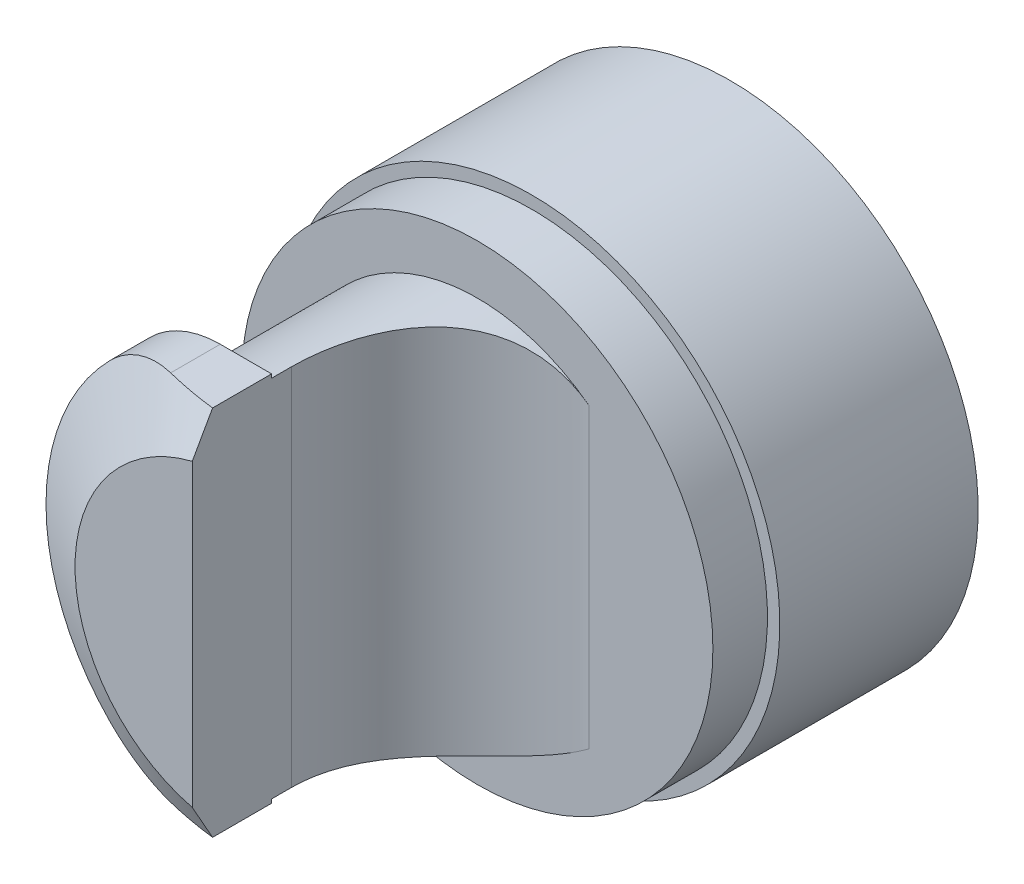
ISO-10303-21;
HEADER;
FILE_DESCRIPTION(('STEP AP214'),'2;1');
FILE_NAME('part.step','',(''),(''),'','','');
FILE_SCHEMA(('AUTOMOTIVE_DESIGN { 1 0 10303 214 1 1 1 1 }'));
ENDSEC;
DATA;
#1=APPLICATION_CONTEXT('core data for automotive mechanical design processes');
#2=APPLICATION_PROTOCOL_DEFINITION('international standard','automotive_design',2000,#1);
#3=PRODUCT_CONTEXT('',#1,'mechanical');
#4=PRODUCT('Part','Part','',(#3));
#5=PRODUCT_RELATED_PRODUCT_CATEGORY('part','',(#4));
#6=PRODUCT_DEFINITION_FORMATION('','',#4);
#7=PRODUCT_DEFINITION_CONTEXT('part definition',#1,'design');
#8=PRODUCT_DEFINITION('design','',#6,#7);
#9=PRODUCT_DEFINITION_SHAPE('','',#8);
#10=(LENGTH_UNIT() NAMED_UNIT(*) SI_UNIT(.MILLI.,.METRE.));
#11=(NAMED_UNIT(*) PLANE_ANGLE_UNIT() SI_UNIT($,.RADIAN.));
#12=(NAMED_UNIT(*) SI_UNIT($,.STERADIAN.) SOLID_ANGLE_UNIT());
#13=UNCERTAINTY_MEASURE_WITH_UNIT(LENGTH_MEASURE(1.E-05),#10,'distance_accuracy_value','');
#14=(GEOMETRIC_REPRESENTATION_CONTEXT(3) GLOBAL_UNCERTAINTY_ASSIGNED_CONTEXT((#13)) GLOBAL_UNIT_ASSIGNED_CONTEXT((#10,
#11,#12)) REPRESENTATION_CONTEXT('',''));
#15=CARTESIAN_POINT('',(0.,0.,0.));
#16=DIRECTION('',(0.,0.,1.));
#17=DIRECTION('',(1.,0.,0.));
#18=AXIS2_PLACEMENT_3D('',#15,#16,#17);
#19=CARTESIAN_POINT('',(0.,0.,3.05));
#20=DIRECTION('',(0.,0.,-1.));
#21=DIRECTION('',(-1.,0.,0.));
#22=AXIS2_PLACEMENT_3D('',#19,#20,#21);
#23=CYLINDRICAL_SURFACE('',#22,2.25);
#24=CARTESIAN_POINT('',(0.,0.,2.65));
#25=DIRECTION('',(0.,0.,1.));
#26=DIRECTION('',(1.,0.,0.));
#27=AXIS2_PLACEMENT_3D('',#24,#25,#26);
#28=CIRCLE('',#27,2.25);
#29=CARTESIAN_POINT('',(-1.60682139642214,-1.575,2.65));
#30=VERTEX_POINT('',#29);
#31=CARTESIAN_POINT('',(-1.60682139642214,1.575,2.65));
#32=VERTEX_POINT('',#31);
#33=EDGE_CURVE('E140',#30,#32,#28,.F.);
#34=ORIENTED_EDGE('',*,*,#33,.T.);
#35=DIRECTION('',(0.,0.,-1.));
#36=VECTOR('',#35,1.);
#37=CARTESIAN_POINT('',(-1.60682139642214,1.575,3.05));
#38=LINE('',#37,#36);
#39=CARTESIAN_POINT('',(-1.60682139642214,1.575,2.25));
#40=VERTEX_POINT('',#39);
#41=EDGE_CURVE('E207',#32,#40,#38,.T.);
#42=ORIENTED_EDGE('',*,*,#41,.T.);
#43=CARTESIAN_POINT('',(0.,0.,2.25));
#44=DIRECTION('',(0.,0.,1.));
#45=DIRECTION('',(1.,0.,0.));
#46=AXIS2_PLACEMENT_3D('',#43,#44,#45);
#47=CIRCLE('',#46,2.25);
#48=CARTESIAN_POINT('',(-1.60682139642214,-1.575,2.25));
#49=VERTEX_POINT('',#48);
#50=EDGE_CURVE('E247',#40,#49,#47,.T.);
#51=ORIENTED_EDGE('',*,*,#50,.T.);
#52=DIRECTION('',(0.,0.,-1.));
#53=VECTOR('',#52,1.);
#54=CARTESIAN_POINT('',(-1.60682139642214,-1.575,3.05));
#55=LINE('',#54,#53);
#56=EDGE_CURVE('E209',#49,#30,#55,.F.);
#57=ORIENTED_EDGE('',*,*,#56,.T.);
#58=EDGE_LOOP('',(#34,#42,#51,#57));
#59=FACE_BOUND('',#58,.T.);
#60=ADVANCED_FACE('F32',(#59),#23,.T.);
#61=CARTESIAN_POINT('',(0.,0.,2.25));
#62=DIRECTION('',(0.,0.,1.));
#63=DIRECTION('',(1.,0.,0.));
#64=AXIS2_PLACEMENT_3D('',#61,#62,#63);
#65=PLANE('',#64);
#66=ORIENTED_EDGE('',*,*,#50,.F.);
#67=CARTESIAN_POINT('',(-0.892678553567856,0.875,2.25));
#68=DIRECTION('',(0.,0.,1.));
#69=DIRECTION('',(1.,0.,0.));
#70=AXIS2_PLACEMENT_3D('',#67,#68,#69);
#71=CIRCLE('',#70,1.);
#72=CARTESIAN_POINT('',(-0.892678553567856,1.875,2.25));
#73=VERTEX_POINT('',#72);
#74=EDGE_CURVE('E203',#40,#73,#71,.F.);
#75=ORIENTED_EDGE('',*,*,#74,.T.);
#76=DIRECTION('',(-1.,0.,0.));
#77=VECTOR('',#76,1.);
#78=CARTESIAN_POINT('',(0.,1.875,2.25));
#79=LINE('',#78,#77);
#80=CARTESIAN_POINT('',(-0.375,1.875,2.25));
#81=VERTEX_POINT('',#80);
#82=EDGE_CURVE('E131',#81,#73,#79,.T.);
#83=ORIENTED_EDGE('',*,*,#82,.F.);
#84=DIRECTION('',(0.,-1.,0.));
#85=VECTOR('',#84,1.);
#86=CARTESIAN_POINT('',(-0.375,0.,2.25));
#87=LINE('',#86,#85);
#88=CARTESIAN_POINT('',(-0.375,1.83711730708738,2.25));
#89=VERTEX_POINT('',#88);
#90=EDGE_CURVE('E130',#81,#89,#87,.T.);
#91=ORIENTED_EDGE('',*,*,#90,.T.);
#92=CARTESIAN_POINT('',(0.,0.,2.25));
#93=DIRECTION('',(0.,0.,1.));
#94=DIRECTION('',(1.,0.,0.));
#95=AXIS2_PLACEMENT_3D('',#92,#93,#94);
#96=CIRCLE('',#95,1.875);
#97=CARTESIAN_POINT('',(-0.375,-1.83711730708738,2.25));
#98=VERTEX_POINT('',#97);
#99=EDGE_CURVE('E292',#89,#98,#96,.T.);
#100=ORIENTED_EDGE('',*,*,#99,.T.);
#101=CARTESIAN_POINT('',(-0.375,-1.875,2.25));
#102=VERTEX_POINT('',#101);
#103=EDGE_CURVE('E298',#98,#102,#87,.T.);
#104=ORIENTED_EDGE('',*,*,#103,.T.);
#105=DIRECTION('',(1.,0.,0.));
#106=VECTOR('',#105,1.);
#107=CARTESIAN_POINT('',(0.,-1.875,2.25));
#108=LINE('',#107,#106);
#109=CARTESIAN_POINT('',(-0.892678553567856,-1.875,2.25));
#110=VERTEX_POINT('',#109);
#111=EDGE_CURVE('E312',#110,#102,#108,.T.);
#112=ORIENTED_EDGE('',*,*,#111,.F.);
#113=CARTESIAN_POINT('',(-0.892678553567856,-0.875,2.25));
#114=DIRECTION('',(0.,0.,1.));
#115=DIRECTION('',(1.,0.,0.));
#116=AXIS2_PLACEMENT_3D('',#113,#114,#115);
#117=CIRCLE('',#116,1.);
#118=EDGE_CURVE('E205',#110,#49,#117,.F.);
#119=ORIENTED_EDGE('',*,*,#118,.T.);
#120=EDGE_LOOP('',(#66,#75,#83,#91,#100,#104,#112,#119));
#121=FACE_BOUND('',#120,.T.);
#122=ADVANCED_FACE('F160',(#121),#65,.F.);
#123=CARTESIAN_POINT('',(-0.375,-3.03688498979674,-5.5699004701883));
#124=DIRECTION('',(-1.,0.,0.));
#125=DIRECTION('',(0.,0.,1.));
#126=AXIS2_PLACEMENT_3D('',#123,#124,#125);
#127=PLANE('',#126);
#128=DIRECTION('',(0.,0.,-1.));
#129=VECTOR('',#128,1.);
#130=CARTESIAN_POINT('',(-0.375,-1.83711730708738,2.25));
#131=LINE('',#130,#129);
#132=CARTESIAN_POINT('',(-0.375,-1.83711730708738,2.05));
#133=VERTEX_POINT('',#132);
#134=EDGE_CURVE('E306',#133,#98,#131,.F.);
#135=ORIENTED_EDGE('',*,*,#134,.F.);
#136=DIRECTION('',(0.,1.,0.));
#137=VECTOR('',#136,1.);
#138=CARTESIAN_POINT('',(-0.375,-3.03688498979674,2.05));
#139=LINE('',#138,#137);
#140=CARTESIAN_POINT('',(-0.375,1.83711730708738,2.05));
#141=VERTEX_POINT('',#140);
#142=EDGE_CURVE('E197',#133,#141,#139,.T.);
#143=ORIENTED_EDGE('',*,*,#142,.T.);
#144=DIRECTION('',(0.,0.,-1.));
#145=VECTOR('',#144,1.);
#146=CARTESIAN_POINT('',(-0.375,1.83711730708738,2.25));
#147=LINE('',#146,#145);
#148=EDGE_CURVE('E304',#89,#141,#147,.T.);
#149=ORIENTED_EDGE('',*,*,#148,.F.);
#150=ORIENTED_EDGE('',*,*,#90,.F.);
#151=DIRECTION('',(0.,0.,-1.));
#152=VECTOR('',#151,1.);
#153=CARTESIAN_POINT('',(-0.375,1.875,-5.5699004701883));
#154=LINE('',#153,#152);
#155=CARTESIAN_POINT('',(-0.374999999984536,1.875,2.84506799738743));
#156=VERTEX_POINT('',#155);
#157=EDGE_CURVE('E114',#156,#81,#154,.T.);
#158=ORIENTED_EDGE('',*,*,#157,.F.);
#159=CARTESIAN_POINT('',(-0.375,2.21852991866236,2.65));
#160=CARTESIAN_POINT('',(-0.375,2.15968993372952,2.68349497391053));
#161=CARTESIAN_POINT('',(-0.375,2.1008350115622,2.71696375090653));
#162=CARTESIAN_POINT('',(-0.375,1.98308452700175,2.78382935955814));
#163=CARTESIAN_POINT('',(-0.375,1.9241889647183,2.81722619140692));
#164=CARTESIAN_POINT('',(-0.375,1.80634603920088,2.88392858311246));
#165=CARTESIAN_POINT('',(-0.375,1.7473986758978,2.91723414284722));
#166=CARTESIAN_POINT('',(-0.375,1.6294330290731,2.98371977517085));
#167=CARTESIAN_POINT('',(-0.375,1.57041474535898,3.0168998474181));
#168=CARTESIAN_POINT('',(-0.375,1.51135156279934,3.05));
#169=B_SPLINE_CURVE_WITH_KNOTS('',3,(#159,#160,#161,#162,#163,#164,#165,#166,#167,#168),
.UNSPECIFIED.,.F.,.F.,(4,2,2,2,4),(0.,0.203117017816692,0.406233489563516,0.609350232638408,
0.812467528260206),.UNSPECIFIED.);
#170=CARTESIAN_POINT('',(-0.375,1.51135156279934,3.05));
#171=VERTEX_POINT('',#170);
#172=EDGE_CURVE('E127',#156,#171,#169,.T.);
#173=ORIENTED_EDGE('',*,*,#172,.T.);
#174=DIRECTION('',(0.,-1.,0.));
#175=VECTOR('',#174,1.);
#176=CARTESIAN_POINT('',(-0.375,-3.03688498979674,3.05));
#177=LINE('',#176,#175);
#178=CARTESIAN_POINT('',(-0.375,-1.51135156279934,3.05));
#179=VERTEX_POINT('',#178);
#180=EDGE_CURVE('E308',#171,#179,#177,.T.);
#181=ORIENTED_EDGE('',*,*,#180,.T.);
#182=CARTESIAN_POINT('',(-0.375,-1.51135156279934,3.05));
#183=CARTESIAN_POINT('',(-0.375,-1.57041474535898,3.0168998474181));
#184=CARTESIAN_POINT('',(-0.375,-1.6294330290731,2.98371977517085));
#185=CARTESIAN_POINT('',(-0.375,-1.7473986758978,2.91723414284722));
#186=CARTESIAN_POINT('',(-0.375,-1.80634603920088,2.88392858311246));
#187=CARTESIAN_POINT('',(-0.375,-1.9241889647183,2.81722619140692));
#188=CARTESIAN_POINT('',(-0.375,-1.98308452700175,2.78382935955814));
#189=CARTESIAN_POINT('',(-0.375,-2.1008350115622,2.71696375090653));
#190=CARTESIAN_POINT('',(-0.375,-2.15968993372952,2.68349497391053));
#191=CARTESIAN_POINT('',(-0.375,-2.21852991866236,2.65));
#192=B_SPLINE_CURVE_WITH_KNOTS('',3,(#182,#183,#184,#185,#186,#187,#188,#189,#190,#191),
.UNSPECIFIED.,.F.,.F.,(4,2,2,2,4),(0.,0.203117295621798,0.40623403869669,0.609350510443514,
0.812467528260206),.UNSPECIFIED.);
#193=CARTESIAN_POINT('',(-0.375,-1.875,2.84506799738568));
#194=VERTEX_POINT('',#193);
#195=EDGE_CURVE('E137',#179,#194,#192,.T.);
#196=ORIENTED_EDGE('',*,*,#195,.T.);
#197=DIRECTION('',(0.,0.,1.));
#198=VECTOR('',#197,1.);
#199=CARTESIAN_POINT('',(-0.375,-1.875,-5.5699004701883));
#200=LINE('',#199,#198);
#201=EDGE_CURVE('E250',#102,#194,#200,.T.);
#202=ORIENTED_EDGE('',*,*,#201,.F.);
#203=ORIENTED_EDGE('',*,*,#103,.F.);
#204=EDGE_LOOP('',(#135,#143,#149,#150,#158,#173,#181,#196,#202,#203));
#205=FACE_BOUND('',#204,.T.);
#206=ADVANCED_FACE('F125',(#205),#127,.F.);
#207=CARTESIAN_POINT('',(0.,0.,3.05));
#208=DIRECTION('',(0.,0.,-1.));
#209=DIRECTION('',(-1.,0.,0.));
#210=AXIS2_PLACEMENT_3D('',#207,#208,#209);
#211=CONICAL_SURFACE('',#210,1.55717967697245,1.0471975511966);
#212=CARTESIAN_POINT('',(0.77551517420227,1.875,2.77756484727964));
#213=CARTESIAN_POINT('',(0.73007828212685,1.875,2.78759139971199));
#214=CARTESIAN_POINT('',(0.684483458480379,1.875,2.796899537944));
#215=CARTESIAN_POINT('',(0.592987609596221,1.875,2.81393435069116));
#216=CARTESIAN_POINT('',(0.547086506149714,1.875,2.82166060396105));
#217=CARTESIAN_POINT('',(0.408946001671618,1.875,2.8422462534341));
#218=CARTESIAN_POINT('',(0.316297737646359,1.875,2.85250610976308));
#219=CARTESIAN_POINT('',(0.132574886718153,1.875,2.86505167553006));
#220=CARTESIAN_POINT('',(0.041512479087597,1.875,2.8675135695237));
#221=CARTESIAN_POINT('',(-0.140443547775259,1.875,2.86474583153236));
#222=CARTESIAN_POINT('',(-0.231337228826834,1.875,2.8595200636123));
#223=CARTESIAN_POINT('',(-0.455475822604412,1.875,2.83761389509425));
#224=CARTESIAN_POINT('',(-0.588304374029833,1.875,2.81666788057499));
#225=CARTESIAN_POINT('',(-0.851406700487642,1.875,2.7622656984015));
#226=CARTESIAN_POINT('',(-0.98167722730516,1.875,2.72879458684475));
#227=CARTESIAN_POINT('',(-1.17604125726333,1.875,2.67160020743556));
#228=CARTESIAN_POINT('',(-1.24114693883111,1.875,2.65118805420931));
#229=CARTESIAN_POINT('',(-1.37068250354892,1.875,2.60844461124686));
#230=CARTESIAN_POINT('',(-1.43511277578088,1.875,2.58611450327038));
#231=CARTESIAN_POINT('',(-1.62750898786172,1.875,2.51675107355756));
#232=CARTESIAN_POINT('',(-1.75461323428828,1.875,2.46733459221373));
#233=CARTESIAN_POINT('',(-2.01195940339039,1.875,2.36210681333425));
#234=CARTESIAN_POINT('',(-2.142128637828,1.875,2.30612063741134));
#235=CARTESIAN_POINT('',(-2.40101010191744,1.875,2.19084744040797));
#236=CARTESIAN_POINT('',(-2.52972212733652,1.875,2.13155996336499));
#237=CARTESIAN_POINT('',(-2.78257485708802,1.875,2.01227436589369));
#238=CARTESIAN_POINT('',(-2.90674517642837,1.875,1.95233861984276));
#239=CARTESIAN_POINT('',(-3.15421335212192,1.875,1.83081684916809));
#240=CARTESIAN_POINT('',(-3.27751154820572,1.875,1.76923151761988));
#241=CARTESIAN_POINT('',(-3.40051517420227,1.875,1.70707999946831));
#242=B_SPLINE_CURVE_WITH_KNOTS('',3,(#212,#213,#214,#215,#216,#217,#218,#219,#220,#221,#222,
#223,#224,#225,#226,#227,#228,#229,#230,#231,#232,#233,#234,#235,#236,#237,#238,#239,#240,#241),
.UNSPECIFIED.,.F.,.F.,(4,2,2,2,2,2,2,2,2,2,2,2,2,2,4),(0.,0.139580379396184,0.279197879897776,
0.558519829828358,0.831484123500799,1.10431126345209,1.50688805165974,1.90994670040144,
2.11461530128089,2.31915868677931,2.72814235593344,3.153180427448,3.57827734983895,
3.99190030295551,4.40535211655301),.UNSPECIFIED.);
#243=CARTESIAN_POINT('',(-0.892678553567855,1.875,2.75008022484848));
#244=VERTEX_POINT('',#243);
#245=EDGE_CURVE('E110',#156,#244,#242,.T.);
#246=ORIENTED_EDGE('',*,*,#245,.T.);
#247=CARTESIAN_POINT('',(-0.892678553567856,1.875,2.75008022484848));
#248=CARTESIAN_POINT('',(-0.919581790580037,1.87499983517563,2.74340360643589));
#249=CARTESIAN_POINT('',(-0.94654864301284,1.87391341656568,2.73703072337631));
#250=CARTESIAN_POINT('',(-1.00044976138333,1.86954390462788,2.72490951054497));
#251=CARTESIAN_POINT('',(-1.02738402007079,1.86626038960332,2.71916130091531));
#252=CARTESIAN_POINT('',(-1.10791571295614,1.85307311644857,2.70287627710788));
#253=CARTESIAN_POINT('',(-1.16120835369302,1.83983256941054,2.69330737833321));
#254=CARTESIAN_POINT('',(-1.26534131029021,1.80459930711908,2.67692212436111));
#255=CARTESIAN_POINT('',(-1.31617715300775,1.78259125553994,2.67011063480731));
#256=CARTESIAN_POINT('',(-1.41366726018164,1.7303448689643,2.65938810574547));
#257=CARTESIAN_POINT('',(-1.46033087695269,1.70012558765332,2.6554704286141));
#258=CARTESIAN_POINT('',(-1.52229920166895,1.65224258491577,2.65201917017177));
#259=CARTESIAN_POINT('',(-1.53994714437921,1.63760728908143,2.65126190377883));
#260=CARTESIAN_POINT('',(-1.57418774762092,1.60716680802337,2.65025279510879));
#261=CARTESIAN_POINT('',(-1.59078142830412,1.59136278678122,2.65000045679946));
#262=CARTESIAN_POINT('',(-1.60682139642215,1.57500000000001,2.65));
#263=B_SPLINE_CURVE_WITH_KNOTS('',3,(#247,#248,#249,#250,#251,#252,#253,#254,#255,#256,#257,
#258,#259,#260,#261,#262),.UNSPECIFIED.,.F.,.F.,(4,2,2,2,2,2,2,4),(0.,0.083110970328413,
0.16623789702544,0.332594627386356,0.499243639650409,0.665509206948275,0.734279159715779,
0.802981520892254),.UNSPECIFIED.);
#264=EDGE_CURVE('E211',#244,#32,#263,.T.);
#265=ORIENTED_EDGE('',*,*,#264,.T.);
#266=ORIENTED_EDGE('',*,*,#33,.F.);
#267=CARTESIAN_POINT('',(-1.60682139642214,-1.575,2.65));
#268=CARTESIAN_POINT('',(-1.58786242240055,-1.59434249156085,2.65000035901196));
#269=CARTESIAN_POINT('',(-1.56812602686401,-1.61290406844184,2.65035314785149));
#270=CARTESIAN_POINT('',(-1.52723062387886,-1.64835408145434,2.65176225771525));
#271=CARTESIAN_POINT('',(-1.50607175665551,-1.6652426821007,2.65281850948426));
#272=CARTESIAN_POINT('',(-1.44075031834378,-1.71316684951496,2.65703435041968));
#273=CARTESIAN_POINT('',(-1.39465793156051,-1.74154724231284,2.66124104509327));
#274=CARTESIAN_POINT('',(-1.29878986773541,-1.79040991182473,2.67237405449017));
#275=CARTESIAN_POINT('',(-1.24901298871822,-1.81088959747155,2.67930125991495));
#276=CARTESIAN_POINT('',(-1.14723553087395,-1.84352939350739,2.69576186529167));
#277=CARTESIAN_POINT('',(-1.09523688643385,-1.85569659044794,2.70529303558515));
#278=CARTESIAN_POINT('',(-1.01790981709724,-1.86745115807895,2.72117401293372));
#279=CARTESIAN_POINT('',(-0.992837887320423,-1.87028978770985,2.72658505946397));
#280=CARTESIAN_POINT('',(-0.94271862695668,-1.87406227341835,2.7379374154138));
#281=CARTESIAN_POINT('',(-0.917671334484993,-1.87499958215895,2.74387774317317));
#282=CARTESIAN_POINT('',(-0.892678553567861,-1.8750000000001,2.75008022484843));
#283=B_SPLINE_CURVE_WITH_KNOTS('',3,(#267,#268,#269,#270,#271,#272,#273,#274,#275,#276,#277,
#278,#279,#280,#281,#282),.UNSPECIFIED.,.F.,.F.,(4,2,2,2,2,2,2,4),(0.,0.0812024122390972,
0.162396831363084,0.32442668667394,0.486509635215342,0.648454232016024,0.725807777349448,
0.803020727962151),.UNSPECIFIED.);
#284=CARTESIAN_POINT('',(-0.892678553567856,-1.875,2.75008022484848));
#285=VERTEX_POINT('',#284);
#286=EDGE_CURVE('E216',#30,#285,#283,.T.);
#287=ORIENTED_EDGE('',*,*,#286,.T.);
#288=CARTESIAN_POINT('',(-3.40051517420227,-1.875,1.70707999946831));
#289=CARTESIAN_POINT('',(-3.32011162089172,-1.875,1.74772691992684));
#290=CARTESIAN_POINT('',(-3.23957562365413,-1.875,1.788113315058));
#291=CARTESIAN_POINT('',(-3.07818183879897,-1.875,1.86824314469414));
#292=CARTESIAN_POINT('',(-2.99732404238453,-1.875,1.90798656146984));
#293=CARTESIAN_POINT('',(-2.75389341781242,-1.875,2.02620979858071));
#294=CARTESIAN_POINT('',(-2.5907564462367,-1.875,2.10353333071429));
#295=CARTESIAN_POINT('',(-2.25612297687946,-1.875,2.25643046487578));
#296=CARTESIAN_POINT('',(-2.08454399141789,-1.875,2.33182666336692));
#297=CARTESIAN_POINT('',(-1.82474931588355,-1.875,2.43888213201205));
#298=CARTESIAN_POINT('',(-1.73777809093127,-1.875,2.47354955802523));
#299=CARTESIAN_POINT('',(-1.56281577403669,-1.875,2.54029250572317));
#300=CARTESIAN_POINT('',(-1.47482442792011,-1.875,2.57236736485071));
#301=CARTESIAN_POINT('',(-1.27882811849963,-1.875,2.63964173794156));
#302=CARTESIAN_POINT('',(-1.17054848362292,-1.875,2.67405392294251));
#303=CARTESIAN_POINT('',(-0.952105095623159,-1.875,2.73617461098296));
#304=CARTESIAN_POINT('',(-0.841942402764982,-1.875,2.76388676149848));
#305=CARTESIAN_POINT('',(-0.621195669234501,-1.875,2.81016488645846));
#306=CARTESIAN_POINT('',(-0.510636881117493,-1.875,2.82884800865325));
#307=CARTESIAN_POINT('',(-0.288261129882068,-1.875,2.8555782809547));
#308=CARTESIAN_POINT('',(-0.176445199994456,-1.875,2.86363360140799));
#309=CARTESIAN_POINT('',(0.0054518073222194,-1.875,2.8672610219293));
#310=CARTESIAN_POINT('',(0.0754776713002997,-1.875,2.86637874224703));
#311=CARTESIAN_POINT('',(0.215347744136933,-1.875,2.86013279317167));
#312=CARTESIAN_POINT('',(0.285191909027755,-1.875,2.85476812497092));
#313=CARTESIAN_POINT('',(0.425532151849088,-1.875,2.8397028955105));
#314=CARTESIAN_POINT('',(0.496020729961982,-1.875,2.82993420114444));
#315=CARTESIAN_POINT('',(0.636311737806758,-1.875,2.8065292485376));
#316=CARTESIAN_POINT('',(0.706114568588122,-1.875,2.7928954096622));
#317=CARTESIAN_POINT('',(0.77551517420227,-1.875,2.77756484727964));
#318=B_SPLINE_CURVE_WITH_KNOTS('',3,(#288,#289,#290,#291,#292,#293,#294,#295,#296,#297,#298,
#299,#300,#301,#302,#303,#304,#305,#306,#307,#308,#309,#310,#311,#312,#313,#314,#315,#316,#317),
.UNSPECIFIED.,.F.,.F.,(4,2,2,2,2,2,2,2,2,2,2,2,2,2,4),(0.,0.270281856000906,0.540571152012483,
1.08213634234132,1.64422777062576,1.92507376251643,2.20599130204925,2.5466822951628,
2.88718739751276,3.22314735507867,3.55884888555888,3.76880859503538,3.97881510217545,
4.19218837931096,4.40542839042843),.UNSPECIFIED.);
#319=EDGE_CURVE('E248',#285,#194,#318,.T.);
#320=ORIENTED_EDGE('',*,*,#319,.T.);
#321=ORIENTED_EDGE('',*,*,#195,.F.);
#322=CARTESIAN_POINT('',(0.,0.,3.05));
#323=DIRECTION('',(0.,0.,1.));
#324=DIRECTION('',(1.,0.,0.));
#325=AXIS2_PLACEMENT_3D('',#322,#323,#324);
#326=CIRCLE('',#325,1.55717967697245);
#327=EDGE_CURVE('E136',#171,#179,#326,.T.);
#328=ORIENTED_EDGE('',*,*,#327,.F.);
#329=ORIENTED_EDGE('',*,*,#172,.F.);
#330=EDGE_LOOP('',(#246,#265,#266,#287,#320,#321,#328,#329));
#331=FACE_BOUND('',#330,.T.);
#332=ADVANCED_FACE('F134',(#331),#211,.T.);
#333=CARTESIAN_POINT('',(0.,0.,0.55));
#334=DIRECTION('',(0.,0.,-1.));
#335=DIRECTION('',(-1.,0.,0.));
#336=AXIS2_PLACEMENT_3D('',#333,#334,#335);
#337=CYLINDRICAL_SURFACE('',#336,2.375);
#338=CARTESIAN_POINT('',(0.,0.,0.55));
#339=DIRECTION('',(0.,0.,1.));
#340=DIRECTION('',(1.,0.,0.));
#341=AXIS2_PLACEMENT_3D('',#338,#339,#340);
#342=CIRCLE('',#341,2.375);
#343=CARTESIAN_POINT('',(2.375,0.,0.55));
#344=VERTEX_POINT('',#343);
#345=EDGE_CURVE('E295',#344,#344,#342,.T.);
#346=ORIENTED_EDGE('',*,*,#345,.F.);
#347=EDGE_LOOP('',(#346));
#348=FACE_BOUND('',#347,.T.);
#349=CARTESIAN_POINT('',(0.,0.,0.));
#350=DIRECTION('',(0.,0.,-1.));
#351=DIRECTION('',(-1.,0.,0.));
#352=AXIS2_PLACEMENT_3D('',#349,#350,#351);
#353=CIRCLE('',#352,2.375);
#354=CARTESIAN_POINT('',(-2.375,0.,0.));
#355=VERTEX_POINT('',#354);
#356=EDGE_CURVE('E282',#355,#355,#353,.T.);
#357=ORIENTED_EDGE('',*,*,#356,.F.);
#358=EDGE_LOOP('',(#357));
#359=FACE_BOUND('',#358,.T.);
#360=ADVANCED_FACE('F316',(#348,#359),#337,.T.);
#361=CARTESIAN_POINT('',(0.,0.,0.55));
#362=DIRECTION('',(0.,0.,1.));
#363=DIRECTION('',(1.,0.,0.));
#364=AXIS2_PLACEMENT_3D('',#361,#362,#363);
#365=PLANE('',#364);
#366=ORIENTED_EDGE('',*,*,#345,.T.);
#367=EDGE_LOOP('',(#366));
#368=FACE_BOUND('',#367,.T.);
#369=CARTESIAN_POINT('',(0.,0.,0.55));
#370=DIRECTION('',(0.,0.,1.));
#371=DIRECTION('',(1.,0.,0.));
#372=AXIS2_PLACEMENT_3D('',#369,#370,#371);
#373=CIRCLE('',#372,1.875);
#374=CARTESIAN_POINT('',(1.125,1.5,0.55));
#375=VERTEX_POINT('',#374);
#376=CARTESIAN_POINT('',(1.125,-1.5,0.55));
#377=VERTEX_POINT('',#376);
#378=EDGE_CURVE('E51',#375,#377,#373,.T.);
#379=ORIENTED_EDGE('',*,*,#378,.F.);
#380=DIRECTION('',(0.,1.,0.));
#381=VECTOR('',#380,1.);
#382=CARTESIAN_POINT('',(1.125,0.,0.55));
#383=LINE('',#382,#381);
#384=EDGE_CURVE('E195',#375,#377,#383,.F.);
#385=ORIENTED_EDGE('',*,*,#384,.T.);
#386=EDGE_LOOP('',(#379,#385));
#387=FACE_BOUND('',#386,.T.);
#388=ADVANCED_FACE('F189',(#368,#387),#365,.T.);
#389=CARTESIAN_POINT('',(0.,0.,2.25));
#390=DIRECTION('',(0.,0.,-1.));
#391=DIRECTION('',(-1.,0.,0.));
#392=AXIS2_PLACEMENT_3D('',#389,#390,#391);
#393=CYLINDRICAL_SURFACE('',#392,1.875);
#394=ORIENTED_EDGE('',*,*,#99,.F.);
#395=ORIENTED_EDGE('',*,*,#148,.T.);
#396=CARTESIAN_POINT('',(-0.375,1.83711730708738,2.05));
#397=CARTESIAN_POINT('',(-0.375004552764185,1.83710537216745,2.00796201936872));
#398=CARTESIAN_POINT('',(-0.373232879866697,1.83747775610632,1.9659275450426));
#399=CARTESIAN_POINT('',(-0.366173032103907,1.83890346745088,1.88217506509932));
#400=CARTESIAN_POINT('',(-0.360885591874861,1.83995665259865,1.84045699520946));
#401=CARTESIAN_POINT('',(-0.346840900689356,1.84265427174096,1.75769243084274));
#402=CARTESIAN_POINT('',(-0.338088979415664,1.84429779721069,1.7166450051881));
#403=CARTESIAN_POINT('',(-0.317189753763766,1.84800633204701,1.63545427768972));
#404=CARTESIAN_POINT('',(-0.305042350929774,1.85007135363489,1.59531100209929));
#405=CARTESIAN_POINT('',(-0.263625603667545,1.85658792043507,1.4766572594062));
#406=CARTESIAN_POINT('',(-0.229367596701461,1.86136440423793,1.39984021436868));
#407=CARTESIAN_POINT('',(-0.148464580529811,1.86955275288994,1.25292170472738));
#408=CARTESIAN_POINT('',(-0.101811353916481,1.87296370868829,1.18282473730392));
#409=CARTESIAN_POINT('',(0.00281796059605152,1.87572943844984,1.05110182841691));
#410=CARTESIAN_POINT('',(0.0608319476231463,1.87507040393986,0.98950545056298));
#411=CARTESIAN_POINT('',(0.186059480419713,1.86679339908207,0.8772108375068));
#412=CARTESIAN_POINT('',(0.253254387838058,1.85918935453997,0.826491044298582));
#413=CARTESIAN_POINT('',(0.387480372802021,1.83567215543846,0.741647612147141));
#414=CARTESIAN_POINT('',(0.453964032184338,1.8205828163015,0.70643016274355));
#415=CARTESIAN_POINT('',(0.589320260810436,1.78136913126852,0.646965173490757));
#416=CARTESIAN_POINT('',(0.658195975040664,1.75723244811086,0.622732713288587));
#417=CARTESIAN_POINT('',(0.761143648557561,1.71397513868404,0.594351981380899));
#418=CARTESIAN_POINT('',(0.79562482048311,1.69825302135531,0.586192901055376));
#419=CARTESIAN_POINT('',(0.863997049890836,1.66450704219574,0.572471745321483));
#420=CARTESIAN_POINT('',(0.897887926944394,1.64648249016455,0.566910450988389));
#421=CARTESIAN_POINT('',(0.964725436007457,1.60823277544453,0.558206090121477));
#422=CARTESIAN_POINT('',(0.997671836113964,1.58800707804449,0.555063612679926));
#423=CARTESIAN_POINT('',(1.06232429880753,1.54550786755225,0.550959344358694));
#424=CARTESIAN_POINT('',(1.09403127989424,1.52323591353043,0.549995907343959));
#425=CARTESIAN_POINT('',(1.125,1.5,0.550000000000001));
#426=B_SPLINE_CURVE_WITH_KNOTS('',3,(#396,#397,#398,#399,#400,#401,#402,#403,#404,#405,#406,
#407,#408,#409,#410,#411,#412,#413,#414,#415,#416,#417,#418,#419,#420,#421,#422,#423,#424,#425),
.UNSPECIFIED.,.F.,.F.,(4,2,2,2,2,2,2,2,2,2,2,2,2,2,4),(0.,0.126068990429907,0.252111646421238,
0.377961149997567,0.503814303099614,0.755271965360751,1.00689674918787,1.25937570176459,
1.51134950429429,1.74027110940038,1.96950602208078,2.08566677589639,2.20186243327431,
2.31808638064979,2.43422249839831),.UNSPECIFIED.);
#427=EDGE_CURVE('E45',#141,#375,#426,.T.);
#428=ORIENTED_EDGE('',*,*,#427,.T.);
#429=ORIENTED_EDGE('',*,*,#378,.T.);
#430=CARTESIAN_POINT('',(1.125,-1.5,0.55));
#431=CARTESIAN_POINT('',(1.09588782348741,-1.52184130300302,0.549996919779177));
#432=CARTESIAN_POINT('',(1.06612539752371,-1.54283142392949,0.550847733416645));
#433=CARTESIAN_POINT('',(1.0054948136089,-1.58301081368275,0.554460186884151));
#434=CARTESIAN_POINT('',(0.974625957095862,-1.60219891608618,0.557223054811679));
#435=CARTESIAN_POINT('',(0.911992923399704,-1.6386604144713,0.564865905309275));
#436=CARTESIAN_POINT('',(0.880228123071106,-1.65593243442992,0.569747397155656));
#437=CARTESIAN_POINT('',(0.816118430485685,-1.68845216795892,0.581783871407095));
#438=CARTESIAN_POINT('',(0.783773678486818,-1.7037003636798,0.588938310927799));
#439=CARTESIAN_POINT('',(0.686018037002781,-1.7464393772153,0.614098105512498));
#440=CARTESIAN_POINT('',(0.620105452914931,-1.77079797337521,0.635775741604135));
#441=CARTESIAN_POINT('',(0.489996507117379,-1.81112519774239,0.689222915285007));
#442=CARTESIAN_POINT('',(0.425797623668987,-1.82710688164421,0.720976624219065));
#443=CARTESIAN_POINT('',(0.304797099035506,-1.851036816529,0.792245329490819));
#444=CARTESIAN_POINT('',(0.247785330723824,-1.85935208022533,0.831283837869084));
#445=CARTESIAN_POINT('',(0.139354402601947,-1.87061076683802,0.917173766253585));
#446=CARTESIAN_POINT('',(0.0879405824570728,-1.87354910240686,0.964032539672933));
#447=CARTESIAN_POINT('',(-0.0110335590469758,-1.87566354459223,1.06771038582215));
#448=CARTESIAN_POINT('',(-0.0581274894023441,-1.87458320726055,1.1249784177904));
#449=CARTESIAN_POINT('',(-0.143336296553431,-1.87000119539065,1.24576587183461));
#450=CARTESIAN_POINT('',(-0.181446540797871,-1.86649827526338,1.30928849533964));
#451=CARTESIAN_POINT('',(-0.251586046746478,-1.85841751670975,1.44854784660642));
#452=CARTESIAN_POINT('',(-0.282471497659407,-1.85376353685917,1.52485777291882));
#453=CARTESIAN_POINT('',(-0.331343110640665,-1.84565960806111,1.68151707031121));
#454=CARTESIAN_POINT('',(-0.349343841513866,-1.84220830152016,1.76186176885724));
#455=CARTESIAN_POINT('',(-0.365438113723879,-1.83904800139119,1.87737866653711));
#456=CARTESIAN_POINT('',(-0.369024439586486,-1.83832892634672,1.91182852512879));
#457=CARTESIAN_POINT('',(-0.37380310186914,-1.83736247089288,1.98084729424239));
#458=CARTESIAN_POINT('',(-0.374999103369525,-1.83711436837148,2.01541594096527));
#459=CARTESIAN_POINT('',(-0.375,-1.83711730708738,2.05));
#460=B_SPLINE_CURVE_WITH_KNOTS('',3,(#430,#431,#432,#433,#434,#435,#436,#437,#438,#439,#440,
#441,#442,#443,#444,#445,#446,#447,#448,#449,#450,#451,#452,#453,#454,#455,#456,#457,#458,#459),
.UNSPECIFIED.,.F.,.F.,(4,2,2,2,2,2,2,2,2,2,2,2,2,2,4),(0.,0.109171401623282,0.218412988339631,
0.327732525211351,0.437025971159264,0.656366816485322,0.875364787696559,1.08323228743307,
1.29129635824096,1.51285871515691,1.7345350747895,1.98080631044433,2.22679864445104,
2.33065813049958,2.43435824642333),.UNSPECIFIED.);
#461=EDGE_CURVE('E11',#377,#133,#460,.T.);
#462=ORIENTED_EDGE('',*,*,#461,.T.);
#463=ORIENTED_EDGE('',*,*,#134,.T.);
#464=EDGE_LOOP('',(#394,#395,#428,#429,#462,#463));
#465=FACE_BOUND('',#464,.T.);
#466=ADVANCED_FACE('F184',(#465),#393,.T.);
#467=CARTESIAN_POINT('',(0.,0.,-2.));
#468=DIRECTION('',(0.,0.,1.));
#469=DIRECTION('',(1.,0.,0.));
#470=AXIS2_PLACEMENT_3D('',#467,#468,#469);
#471=CYLINDRICAL_SURFACE('',#470,2.5);
#472=CARTESIAN_POINT('',(0.,0.,-2.));
#473=DIRECTION('',(0.,0.,-1.));
#474=DIRECTION('',(-1.,0.,0.));
#475=AXIS2_PLACEMENT_3D('',#472,#473,#474);
#476=CIRCLE('',#475,2.5);
#477=CARTESIAN_POINT('',(-2.5,0.,-2.));
#478=VERTEX_POINT('',#477);
#479=EDGE_CURVE('E281',#478,#478,#476,.T.);
#480=ORIENTED_EDGE('',*,*,#479,.F.);
#481=EDGE_LOOP('',(#480));
#482=FACE_BOUND('',#481,.T.);
#483=CARTESIAN_POINT('',(0.,0.,0.));
#484=DIRECTION('',(0.,0.,-1.));
#485=DIRECTION('',(-1.,0.,0.));
#486=AXIS2_PLACEMENT_3D('',#483,#484,#485);
#487=CIRCLE('',#486,2.5);
#488=CARTESIAN_POINT('',(-2.5,0.,0.));
#489=VERTEX_POINT('',#488);
#490=EDGE_CURVE('E283',#489,#489,#487,.T.);
#491=ORIENTED_EDGE('',*,*,#490,.T.);
#492=EDGE_LOOP('',(#491));
#493=FACE_BOUND('',#492,.T.);
#494=ADVANCED_FACE('F178',(#482,#493),#471,.T.);
#495=CARTESIAN_POINT('',(0.,0.,-2.));
#496=DIRECTION('',(0.,0.,-1.));
#497=DIRECTION('',(-1.,0.,0.));
#498=AXIS2_PLACEMENT_3D('',#495,#496,#497);
#499=PLANE('',#498);
#500=CARTESIAN_POINT('',(0.,0.,-2.));
#501=DIRECTION('',(0.,0.,-1.));
#502=DIRECTION('',(-1.,0.,0.));
#503=AXIS2_PLACEMENT_3D('',#500,#501,#502);
#504=CIRCLE('',#503,1.);
#505=CARTESIAN_POINT('',(-1.,0.,-2.));
#506=VERTEX_POINT('',#505);
#507=EDGE_CURVE('E269',#506,#506,#504,.T.);
#508=ORIENTED_EDGE('',*,*,#507,.F.);
#509=EDGE_LOOP('',(#508));
#510=FACE_BOUND('',#509,.T.);
#511=ORIENTED_EDGE('',*,*,#479,.T.);
#512=EDGE_LOOP('',(#511));
#513=FACE_BOUND('',#512,.T.);
#514=ADVANCED_FACE('F175',(#510,#513),#499,.T.);
#515=CARTESIAN_POINT('',(0.,0.,0.));
#516=DIRECTION('',(0.,0.,-1.));
#517=DIRECTION('',(-1.,0.,0.));
#518=AXIS2_PLACEMENT_3D('',#515,#516,#517);
#519=PLANE('',#518);
#520=ORIENTED_EDGE('',*,*,#356,.T.);
#521=EDGE_LOOP('',(#520));
#522=FACE_BOUND('',#521,.T.);
#523=ORIENTED_EDGE('',*,*,#490,.F.);
#524=EDGE_LOOP('',(#523));
#525=FACE_BOUND('',#524,.T.);
#526=ADVANCED_FACE('F167',(#522,#525),#519,.F.);
#527=CARTESIAN_POINT('',(0.,0.,3.05));
#528=DIRECTION('',(0.,0.,1.));
#529=DIRECTION('',(1.,0.,0.));
#530=AXIS2_PLACEMENT_3D('',#527,#528,#529);
#531=PLANE('',#530);
#532=ORIENTED_EDGE('',*,*,#180,.F.);
#533=ORIENTED_EDGE('',*,*,#327,.T.);
#534=EDGE_LOOP('',(#532,#533));
#535=FACE_BOUND('',#534,.T.);
#536=ADVANCED_FACE('F163',(#535),#531,.T.);
#537=CARTESIAN_POINT('',(-3.27929292204837,1.875,1.05));
#538=DIRECTION('',(0.,1.,0.));
#539=DIRECTION('',(0.,0.,1.));
#540=AXIS2_PLACEMENT_3D('',#537,#538,#539);
#541=PLANE('',#540);
#542=ORIENTED_EDGE('',*,*,#82,.T.);
#543=DIRECTION('',(0.,0.,1.));
#544=VECTOR('',#543,1.);
#545=CARTESIAN_POINT('',(-0.892678553567856,1.875,2.65));
#546=LINE('',#545,#544);
#547=EDGE_CURVE('E117',#73,#244,#546,.T.);
#548=ORIENTED_EDGE('',*,*,#547,.T.);
#549=ORIENTED_EDGE('',*,*,#245,.F.);
#550=ORIENTED_EDGE('',*,*,#157,.T.);
#551=EDGE_LOOP('',(#542,#548,#549,#550));
#552=FACE_BOUND('',#551,.T.);
#553=ADVANCED_FACE('F113',(#552),#541,.T.);
#554=CARTESIAN_POINT('',(-3.27929292204837,-1.875,1.05));
#555=DIRECTION('',(0.,-1.,0.));
#556=DIRECTION('',(0.,0.,-1.));
#557=AXIS2_PLACEMENT_3D('',#554,#555,#556);
#558=PLANE('',#557);
#559=ORIENTED_EDGE('',*,*,#319,.F.);
#560=DIRECTION('',(0.,0.,1.));
#561=VECTOR('',#560,1.);
#562=CARTESIAN_POINT('',(-0.892678553567856,-1.875,2.25));
#563=LINE('',#562,#561);
#564=EDGE_CURVE('E200',#285,#110,#563,.F.);
#565=ORIENTED_EDGE('',*,*,#564,.T.);
#566=ORIENTED_EDGE('',*,*,#111,.T.);
#567=ORIENTED_EDGE('',*,*,#201,.T.);
#568=EDGE_LOOP('',(#559,#565,#566,#567));
#569=FACE_BOUND('',#568,.T.);
#570=ADVANCED_FACE('F225',(#569),#558,.T.);
#571=CARTESIAN_POINT('',(-0.892678553567856,0.875,3.05));
#572=DIRECTION('',(0.,0.,-1.));
#573=DIRECTION('',(-1.,0.,0.));
#574=AXIS2_PLACEMENT_3D('',#571,#572,#573);
#575=CYLINDRICAL_SURFACE('',#574,1.);
#576=ORIENTED_EDGE('',*,*,#74,.F.);
#577=ORIENTED_EDGE('',*,*,#41,.F.);
#578=ORIENTED_EDGE('',*,*,#264,.F.);
#579=ORIENTED_EDGE('',*,*,#547,.F.);
#580=EDGE_LOOP('',(#576,#577,#578,#579));
#581=FACE_BOUND('',#580,.T.);
#582=ADVANCED_FACE('F221',(#581),#575,.T.);
#583=CARTESIAN_POINT('',(-0.892678553567856,-0.875,3.05));
#584=DIRECTION('',(0.,0.,-1.));
#585=DIRECTION('',(-1.,0.,0.));
#586=AXIS2_PLACEMENT_3D('',#583,#584,#585);
#587=CYLINDRICAL_SURFACE('',#586,1.);
#588=ORIENTED_EDGE('',*,*,#286,.F.);
#589=ORIENTED_EDGE('',*,*,#56,.F.);
#590=ORIENTED_EDGE('',*,*,#118,.F.);
#591=ORIENTED_EDGE('',*,*,#564,.F.);
#592=EDGE_LOOP('',(#588,#589,#590,#591));
#593=FACE_BOUND('',#592,.T.);
#594=ADVANCED_FACE('F224',(#593),#587,.T.);
#595=CARTESIAN_POINT('',(0.,0.,0.));
#596=DIRECTION('',(0.,0.,-1.));
#597=DIRECTION('',(-1.,0.,0.));
#598=AXIS2_PLACEMENT_3D('',#595,#596,#597);
#599=CYLINDRICAL_SURFACE('',#598,1.);
#600=CARTESIAN_POINT('',(0.,0.,0.));
#601=DIRECTION('',(0.,0.,-1.));
#602=DIRECTION('',(-1.,0.,0.));
#603=AXIS2_PLACEMENT_3D('',#600,#601,#602);
#604=CIRCLE('',#603,1.);
#605=CARTESIAN_POINT('',(-1.,0.,0.));
#606=VERTEX_POINT('',#605);
#607=EDGE_CURVE('E120',#606,#606,#604,.T.);
#608=ORIENTED_EDGE('',*,*,#607,.F.);
#609=EDGE_LOOP('',(#608));
#610=FACE_BOUND('',#609,.T.);
#611=ORIENTED_EDGE('',*,*,#507,.T.);
#612=EDGE_LOOP('',(#611));
#613=FACE_BOUND('',#612,.T.);
#614=ADVANCED_FACE('F229',(#610,#613),#599,.F.);
#615=CARTESIAN_POINT('',(0.,0.,0.));
#616=DIRECTION('',(0.,0.,-1.));
#617=DIRECTION('',(-1.,0.,0.));
#618=AXIS2_PLACEMENT_3D('',#615,#616,#617);
#619=PLANE('',#618);
#620=ORIENTED_EDGE('',*,*,#607,.T.);
#621=EDGE_LOOP('',(#620));
#622=FACE_BOUND('',#621,.T.);
#623=ADVANCED_FACE('F234',(#622),#619,.T.);
#624=CARTESIAN_POINT('',(1.125,-3.03688498979674,2.05));
#625=DIRECTION('',(0.,1.,0.));
#626=DIRECTION('',(0.,0.,1.));
#627=AXIS2_PLACEMENT_3D('',#624,#625,#626);
#628=CYLINDRICAL_SURFACE('',#627,1.5);
#629=ORIENTED_EDGE('',*,*,#461,.F.);
#630=ORIENTED_EDGE('',*,*,#384,.F.);
#631=ORIENTED_EDGE('',*,*,#427,.F.);
#632=ORIENTED_EDGE('',*,*,#142,.F.);
#633=EDGE_LOOP('',(#629,#630,#631,#632));
#634=FACE_BOUND('',#633,.T.);
#635=ADVANCED_FACE('F34',(#634),#628,.F.);
#636=CLOSED_SHELL('',(#60,#122,#206,#332,#360,#388,#466,#494,#514,#526,#536,#553,#570,#582,#594,
#614,#623,#635));
#637=MANIFOLD_SOLID_BREP('B2',#636);
#638=ADVANCED_BREP_SHAPE_REPRESENTATION('',(#18,#637),#14);
#639=SHAPE_DEFINITION_REPRESENTATION(#9,#638);
ENDSEC;
END-ISO-10303-21;
